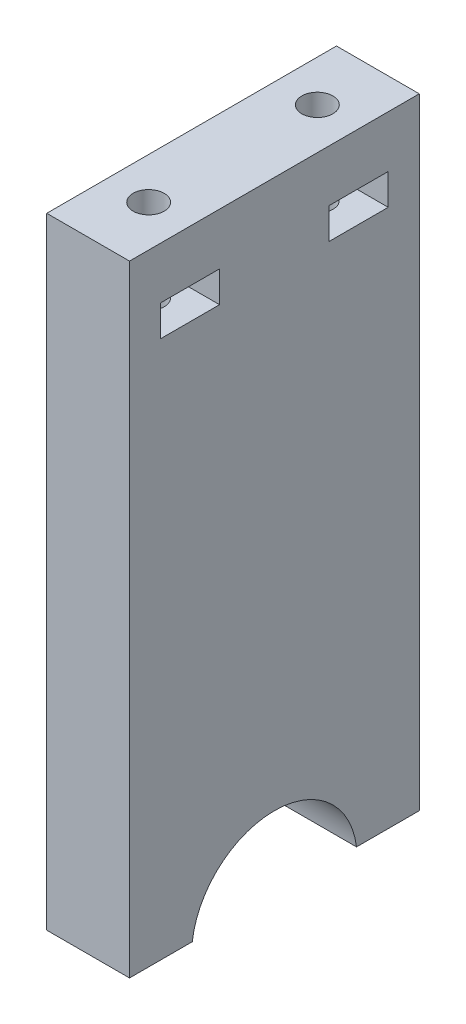
ISO-10303-21;
HEADER;
FILE_DESCRIPTION(('STEP AP214'),'2;1');
FILE_NAME('part.step','',(''),(''),'','','');
FILE_SCHEMA(('AUTOMOTIVE_DESIGN { 1 0 10303 214 1 1 1 1 }'));
ENDSEC;
DATA;
#1=APPLICATION_CONTEXT('core data for automotive mechanical design processes');
#2=APPLICATION_PROTOCOL_DEFINITION('international standard','automotive_design',2000,#1);
#3=PRODUCT_CONTEXT('',#1,'mechanical');
#4=PRODUCT('Part','Part','',(#3));
#5=PRODUCT_RELATED_PRODUCT_CATEGORY('part','',(#4));
#6=PRODUCT_DEFINITION_FORMATION('','',#4);
#7=PRODUCT_DEFINITION_CONTEXT('part definition',#1,'design');
#8=PRODUCT_DEFINITION('design','',#6,#7);
#9=PRODUCT_DEFINITION_SHAPE('','',#8);
#10=(LENGTH_UNIT() NAMED_UNIT(*) SI_UNIT(.MILLI.,.METRE.));
#11=(NAMED_UNIT(*) PLANE_ANGLE_UNIT() SI_UNIT($,.RADIAN.));
#12=(NAMED_UNIT(*) SI_UNIT($,.STERADIAN.) SOLID_ANGLE_UNIT());
#13=UNCERTAINTY_MEASURE_WITH_UNIT(LENGTH_MEASURE(1.E-05),#10,'distance_accuracy_value','');
#14=(GEOMETRIC_REPRESENTATION_CONTEXT(3) GLOBAL_UNCERTAINTY_ASSIGNED_CONTEXT((#13)) GLOBAL_UNIT_ASSIGNED_CONTEXT((#10,
#11,#12)) REPRESENTATION_CONTEXT('',''));
#15=CARTESIAN_POINT('',(0.,0.,0.));
#16=DIRECTION('',(0.,0.,1.));
#17=DIRECTION('',(1.,0.,0.));
#18=AXIS2_PLACEMENT_3D('',#15,#16,#17);
#19=CARTESIAN_POINT('',(0.,0.,0.));
#20=DIRECTION('',(0.,1.,0.));
#21=DIRECTION('',(0.,0.,1.));
#22=AXIS2_PLACEMENT_3D('',#19,#20,#21);
#23=PLANE('',#22);
#24=CARTESIAN_POINT('',(5.99999999999999,0.,2.65044247787611));
#25=DIRECTION('',(0.,-1.,0.));
#26=DIRECTION('',(0.,0.,-1.));
#27=AXIS2_PLACEMENT_3D('',#24,#25,#26);
#28=CIRCLE('',#27,1.5);
#29=CARTESIAN_POINT('',(5.99999999999999,0.,1.15044247787611));
#30=VERTEX_POINT('',#29);
#31=EDGE_CURVE('E201',#30,#30,#28,.T.);
#32=ORIENTED_EDGE('',*,*,#31,.F.);
#33=EDGE_LOOP('',(#32));
#34=FACE_BOUND('',#33,.T.);
#35=DIRECTION('',(0.,0.,1.));
#36=VECTOR('',#35,1.);
#37=CARTESIAN_POINT('',(1.99999999999999,0.,-21.8495575221239));
#38=LINE('',#37,#36);
#39=CARTESIAN_POINT('',(1.99999999999999,0.,0.0876964110698811));
#40=VERTEX_POINT('',#39);
#41=CARTESIAN_POINT('',(1.99999999999999,0.,6.15044247787611));
#42=VERTEX_POINT('',#41);
#43=EDGE_CURVE('E227',#40,#42,#38,.T.);
#44=ORIENTED_EDGE('',*,*,#43,.F.);
#45=DIRECTION('',(1.,0.,0.));
#46=VECTOR('',#45,1.);
#47=CARTESIAN_POINT('',(1.99999999999999,0.,0.0876964110698811));
#48=LINE('',#47,#46);
#49=CARTESIAN_POINT('',(9.99999999999999,0.,0.0876964110698806));
#50=VERTEX_POINT('',#49);
#51=EDGE_CURVE('E223',#40,#50,#48,.T.);
#52=ORIENTED_EDGE('',*,*,#51,.T.);
#53=DIRECTION('',(0.,0.,-1.));
#54=VECTOR('',#53,1.);
#55=CARTESIAN_POINT('',(9.99999999999999,0.,-21.8495575221239));
#56=LINE('',#55,#54);
#57=CARTESIAN_POINT('',(9.99999999999999,0.,6.15044247787611));
#58=VERTEX_POINT('',#57);
#59=EDGE_CURVE('E247',#58,#50,#56,.T.);
#60=ORIENTED_EDGE('',*,*,#59,.F.);
#61=DIRECTION('',(1.,0.,0.));
#62=VECTOR('',#61,1.);
#63=CARTESIAN_POINT('',(1.99999999999999,0.,6.15044247787611));
#64=LINE('',#63,#62);
#65=EDGE_CURVE('E244',#42,#58,#64,.T.);
#66=ORIENTED_EDGE('',*,*,#65,.F.);
#67=EDGE_LOOP('',(#44,#52,#60,#66));
#68=FACE_BOUND('',#67,.T.);
#69=ADVANCED_FACE('F33',(#34,#68),#23,.F.);
#70=CARTESIAN_POINT('',(1.99999999999999,60.,-21.8495575221239));
#71=DIRECTION('',(1.,0.,0.));
#72=DIRECTION('',(0.,0.,-1.));
#73=AXIS2_PLACEMENT_3D('',#70,#71,#72);
#74=PLANE('',#73);
#75=DIRECTION('',(0.,0.,1.));
#76=VECTOR('',#75,1.);
#77=CARTESIAN_POINT('',(1.99999999999999,52.,-2.54955752212389));
#78=LINE('',#77,#76);
#79=CARTESIAN_POINT('',(1.99999999999999,52.,-2.54955752212389));
#80=VERTEX_POINT('',#79);
#81=CARTESIAN_POINT('',(1.99999999999999,52.,3.15044247787611));
#82=VERTEX_POINT('',#81);
#83=EDGE_CURVE('E166',#80,#82,#78,.T.);
#84=ORIENTED_EDGE('',*,*,#83,.F.);
#85=DIRECTION('',(0.,-1.,0.));
#86=VECTOR('',#85,1.);
#87=CARTESIAN_POINT('',(1.99999999999999,52.,-2.54955752212389));
#88=LINE('',#87,#86);
#89=CARTESIAN_POINT('',(1.99999999999999,55.,-2.54955752212389));
#90=VERTEX_POINT('',#89);
#91=EDGE_CURVE('E50',#90,#80,#88,.T.);
#92=ORIENTED_EDGE('',*,*,#91,.F.);
#93=DIRECTION('',(0.,0.,-1.));
#94=VECTOR('',#93,1.);
#95=CARTESIAN_POINT('',(1.99999999999999,55.,-2.54955752212389));
#96=LINE('',#95,#94);
#97=CARTESIAN_POINT('',(1.99999999999999,55.,3.15044247787611));
#98=VERTEX_POINT('',#97);
#99=EDGE_CURVE('E154',#98,#90,#96,.T.);
#100=ORIENTED_EDGE('',*,*,#99,.F.);
#101=DIRECTION('',(0.,1.,0.));
#102=VECTOR('',#101,1.);
#103=CARTESIAN_POINT('',(1.99999999999999,52.,3.15044247787611));
#104=LINE('',#103,#102);
#105=EDGE_CURVE('E157',#82,#98,#104,.T.);
#106=ORIENTED_EDGE('',*,*,#105,.F.);
#107=EDGE_LOOP('',(#84,#92,#100,#106));
#108=FACE_BOUND('',#107,.T.);
#109=DIRECTION('',(0.,0.,1.));
#110=VECTOR('',#109,1.);
#111=CARTESIAN_POINT('',(1.99999999999999,52.,-18.8495575221239));
#112=LINE('',#111,#110);
#113=CARTESIAN_POINT('',(1.99999999999999,52.,-18.8495575221239));
#114=VERTEX_POINT('',#113);
#115=CARTESIAN_POINT('',(1.99999999999999,52.,-13.1495575221239));
#116=VERTEX_POINT('',#115);
#117=EDGE_CURVE('E191',#114,#116,#112,.T.);
#118=ORIENTED_EDGE('',*,*,#117,.F.);
#119=DIRECTION('',(0.,-1.,0.));
#120=VECTOR('',#119,1.);
#121=CARTESIAN_POINT('',(1.99999999999999,52.,-18.8495575221239));
#122=LINE('',#121,#120);
#123=CARTESIAN_POINT('',(1.99999999999999,55.,-18.8495575221239));
#124=VERTEX_POINT('',#123);
#125=EDGE_CURVE('E172',#124,#114,#122,.T.);
#126=ORIENTED_EDGE('',*,*,#125,.F.);
#127=DIRECTION('',(0.,0.,-1.));
#128=VECTOR('',#127,1.);
#129=CARTESIAN_POINT('',(1.99999999999999,55.,-18.8495575221239));
#130=LINE('',#129,#128);
#131=CARTESIAN_POINT('',(1.99999999999999,55.,-13.1495575221239));
#132=VERTEX_POINT('',#131);
#133=EDGE_CURVE('E180',#132,#124,#130,.T.);
#134=ORIENTED_EDGE('',*,*,#133,.F.);
#135=DIRECTION('',(0.,1.,0.));
#136=VECTOR('',#135,1.);
#137=CARTESIAN_POINT('',(1.99999999999999,52.,-13.1495575221239));
#138=LINE('',#137,#136);
#139=EDGE_CURVE('E194',#116,#132,#138,.T.);
#140=ORIENTED_EDGE('',*,*,#139,.F.);
#141=EDGE_LOOP('',(#118,#126,#134,#140));
#142=FACE_BOUND('',#141,.T.);
#143=CARTESIAN_POINT('',(1.99999999999999,0.,-21.8495575221239));
#144=VERTEX_POINT('',#143);
#145=CARTESIAN_POINT('',(1.99999999999999,0.,-15.7868114553177));
#146=VERTEX_POINT('',#145);
#147=EDGE_CURVE('E241',#144,#146,#38,.T.);
#148=ORIENTED_EDGE('',*,*,#147,.T.);
#149=CARTESIAN_POINT('',(1.99999999999999,-1.,-7.84955752212389));
#150=DIRECTION('',(1.,0.,0.));
#151=DIRECTION('',(0.,0.,-1.));
#152=AXIS2_PLACEMENT_3D('',#149,#150,#151);
#153=CIRCLE('',#152,8.);
#154=EDGE_CURVE('E220',#146,#40,#153,.T.);
#155=ORIENTED_EDGE('',*,*,#154,.T.);
#156=ORIENTED_EDGE('',*,*,#43,.T.);
#157=DIRECTION('',(0.,-1.,0.));
#158=VECTOR('',#157,1.);
#159=CARTESIAN_POINT('',(1.99999999999999,60.,6.15044247787611));
#160=LINE('',#159,#158);
#161=CARTESIAN_POINT('',(1.99999999999999,60.,6.15044247787611));
#162=VERTEX_POINT('',#161);
#163=EDGE_CURVE('E11',#162,#42,#160,.T.);
#164=ORIENTED_EDGE('',*,*,#163,.F.);
#165=DIRECTION('',(0.,0.,1.));
#166=VECTOR('',#165,1.);
#167=CARTESIAN_POINT('',(1.99999999999999,60.,-21.8495575221239));
#168=LINE('',#167,#166);
#169=CARTESIAN_POINT('',(1.99999999999999,60.,-21.8495575221239));
#170=VERTEX_POINT('',#169);
#171=EDGE_CURVE('E230',#170,#162,#168,.T.);
#172=ORIENTED_EDGE('',*,*,#171,.F.);
#173=DIRECTION('',(0.,-1.,0.));
#174=VECTOR('',#173,1.);
#175=CARTESIAN_POINT('',(1.99999999999999,60.,-21.8495575221239));
#176=LINE('',#175,#174);
#177=EDGE_CURVE('E240',#170,#144,#176,.T.);
#178=ORIENTED_EDGE('',*,*,#177,.T.);
#179=EDGE_LOOP('',(#148,#155,#156,#164,#172,#178));
#180=FACE_BOUND('',#179,.T.);
#181=ADVANCED_FACE('F35',(#108,#142,#180),#74,.F.);
#182=CARTESIAN_POINT('',(1.99999999999999,60.,6.15044247787611));
#183=DIRECTION('',(0.,0.,-1.));
#184=DIRECTION('',(-1.,0.,0.));
#185=AXIS2_PLACEMENT_3D('',#182,#183,#184);
#186=PLANE('',#185);
#187=ORIENTED_EDGE('',*,*,#65,.T.);
#188=DIRECTION('',(0.,-1.,0.));
#189=VECTOR('',#188,1.);
#190=CARTESIAN_POINT('',(9.99999999999999,60.,6.15044247787611));
#191=LINE('',#190,#189);
#192=CARTESIAN_POINT('',(9.99999999999999,60.,6.15044247787611));
#193=VERTEX_POINT('',#192);
#194=EDGE_CURVE('E42',#193,#58,#191,.T.);
#195=ORIENTED_EDGE('',*,*,#194,.F.);
#196=DIRECTION('',(1.,0.,0.));
#197=VECTOR('',#196,1.);
#198=CARTESIAN_POINT('',(1.99999999999999,60.,6.15044247787611));
#199=LINE('',#198,#197);
#200=EDGE_CURVE('E233',#162,#193,#199,.T.);
#201=ORIENTED_EDGE('',*,*,#200,.F.);
#202=ORIENTED_EDGE('',*,*,#163,.T.);
#203=EDGE_LOOP('',(#187,#195,#201,#202));
#204=FACE_BOUND('',#203,.T.);
#205=ADVANCED_FACE('F305',(#204),#186,.F.);
#206=CARTESIAN_POINT('',(9.99999999999999,60.,-21.8495575221239));
#207=DIRECTION('',(-1.,0.,0.));
#208=DIRECTION('',(0.,0.,1.));
#209=AXIS2_PLACEMENT_3D('',#206,#207,#208);
#210=PLANE('',#209);
#211=DIRECTION('',(0.,0.,-1.));
#212=VECTOR('',#211,1.);
#213=CARTESIAN_POINT('',(10.,55.,-2.5495575221239));
#214=LINE('',#213,#212);
#215=CARTESIAN_POINT('',(10.,55.,3.1504424778761));
#216=VERTEX_POINT('',#215);
#217=CARTESIAN_POINT('',(10.,55.,-2.5495575221239));
#218=VERTEX_POINT('',#217);
#219=EDGE_CURVE('E144',#216,#218,#214,.T.);
#220=ORIENTED_EDGE('',*,*,#219,.T.);
#221=DIRECTION('',(0.,-1.,0.));
#222=VECTOR('',#221,1.);
#223=CARTESIAN_POINT('',(10.,52.,-2.5495575221239));
#224=LINE('',#223,#222);
#225=CARTESIAN_POINT('',(10.,52.,-2.5495575221239));
#226=VERTEX_POINT('',#225);
#227=EDGE_CURVE('E138',#218,#226,#224,.T.);
#228=ORIENTED_EDGE('',*,*,#227,.T.);
#229=DIRECTION('',(0.,0.,1.));
#230=VECTOR('',#229,1.);
#231=CARTESIAN_POINT('',(10.,52.,-2.5495575221239));
#232=LINE('',#231,#230);
#233=CARTESIAN_POINT('',(9.99999999999999,52.,3.15044247787611));
#234=VERTEX_POINT('',#233);
#235=EDGE_CURVE('E147',#226,#234,#232,.T.);
#236=ORIENTED_EDGE('',*,*,#235,.T.);
#237=DIRECTION('',(0.,1.,0.));
#238=VECTOR('',#237,1.);
#239=CARTESIAN_POINT('',(10.,52.,3.1504424778761));
#240=LINE('',#239,#238);
#241=EDGE_CURVE('E58',#234,#216,#240,.T.);
#242=ORIENTED_EDGE('',*,*,#241,.T.);
#243=EDGE_LOOP('',(#220,#228,#236,#242));
#244=FACE_BOUND('',#243,.T.);
#245=DIRECTION('',(0.,0.,-1.));
#246=VECTOR('',#245,1.);
#247=CARTESIAN_POINT('',(9.99999999999999,55.,-18.8495575221239));
#248=LINE('',#247,#246);
#249=CARTESIAN_POINT('',(9.99999999999999,55.,-13.1495575221239));
#250=VERTEX_POINT('',#249);
#251=CARTESIAN_POINT('',(9.99999999999999,55.,-18.8495575221239));
#252=VERTEX_POINT('',#251);
#253=EDGE_CURVE('E186',#250,#252,#248,.T.);
#254=ORIENTED_EDGE('',*,*,#253,.T.);
#255=DIRECTION('',(0.,-1.,0.));
#256=VECTOR('',#255,1.);
#257=CARTESIAN_POINT('',(9.99999999999999,52.,-18.8495575221239));
#258=LINE('',#257,#256);
#259=CARTESIAN_POINT('',(9.99999999999999,52.,-18.8495575221239));
#260=VERTEX_POINT('',#259);
#261=EDGE_CURVE('E176',#252,#260,#258,.T.);
#262=ORIENTED_EDGE('',*,*,#261,.T.);
#263=DIRECTION('',(0.,0.,1.));
#264=VECTOR('',#263,1.);
#265=CARTESIAN_POINT('',(9.99999999999999,52.,-18.8495575221239));
#266=LINE('',#265,#264);
#267=CARTESIAN_POINT('',(9.99999999999999,52.,-13.1495575221239));
#268=VERTEX_POINT('',#267);
#269=EDGE_CURVE('E179',#260,#268,#266,.T.);
#270=ORIENTED_EDGE('',*,*,#269,.T.);
#271=DIRECTION('',(0.,1.,0.));
#272=VECTOR('',#271,1.);
#273=CARTESIAN_POINT('',(9.99999999999999,52.,-13.1495575221239));
#274=LINE('',#273,#272);
#275=EDGE_CURVE('E183',#268,#250,#274,.T.);
#276=ORIENTED_EDGE('',*,*,#275,.T.);
#277=EDGE_LOOP('',(#254,#262,#270,#276));
#278=FACE_BOUND('',#277,.T.);
#279=ORIENTED_EDGE('',*,*,#59,.T.);
#280=CARTESIAN_POINT('',(9.99999999999999,-1.,-7.84955752212389));
#281=DIRECTION('',(1.,0.,0.));
#282=DIRECTION('',(0.,0.,-1.));
#283=AXIS2_PLACEMENT_3D('',#280,#281,#282);
#284=CIRCLE('',#283,8.);
#285=CARTESIAN_POINT('',(9.99999999999999,0.,-15.7868114553177));
#286=VERTEX_POINT('',#285);
#287=EDGE_CURVE('E217',#286,#50,#284,.T.);
#288=ORIENTED_EDGE('',*,*,#287,.F.);
#289=CARTESIAN_POINT('',(9.99999999999999,0.,-21.8495575221239));
#290=VERTEX_POINT('',#289);
#291=EDGE_CURVE('E246',#286,#290,#56,.T.);
#292=ORIENTED_EDGE('',*,*,#291,.T.);
#293=DIRECTION('',(0.,-1.,0.));
#294=VECTOR('',#293,1.);
#295=CARTESIAN_POINT('',(9.99999999999999,60.,-21.8495575221239));
#296=LINE('',#295,#294);
#297=CARTESIAN_POINT('',(9.99999999999999,60.,-21.8495575221239));
#298=VERTEX_POINT('',#297);
#299=EDGE_CURVE('E253',#298,#290,#296,.T.);
#300=ORIENTED_EDGE('',*,*,#299,.F.);
#301=DIRECTION('',(0.,0.,-1.));
#302=VECTOR('',#301,1.);
#303=CARTESIAN_POINT('',(9.99999999999999,60.,-21.8495575221239));
#304=LINE('',#303,#302);
#305=EDGE_CURVE('E236',#193,#298,#304,.T.);
#306=ORIENTED_EDGE('',*,*,#305,.F.);
#307=ORIENTED_EDGE('',*,*,#194,.T.);
#308=EDGE_LOOP('',(#279,#288,#292,#300,#306,#307));
#309=FACE_BOUND('',#308,.T.);
#310=ADVANCED_FACE('F151',(#244,#278,#309),#210,.F.);
#311=CARTESIAN_POINT('',(1.99999999999999,60.,-21.8495575221239));
#312=DIRECTION('',(0.,0.,1.));
#313=DIRECTION('',(1.,0.,0.));
#314=AXIS2_PLACEMENT_3D('',#311,#312,#313);
#315=PLANE('',#314);
#316=DIRECTION('',(-1.,0.,0.));
#317=VECTOR('',#316,1.);
#318=CARTESIAN_POINT('',(1.99999999999999,0.,-21.8495575221239));
#319=LINE('',#318,#317);
#320=EDGE_CURVE('E234',#290,#144,#319,.T.);
#321=ORIENTED_EDGE('',*,*,#320,.T.);
#322=ORIENTED_EDGE('',*,*,#177,.F.);
#323=DIRECTION('',(-1.,0.,0.));
#324=VECTOR('',#323,1.);
#325=CARTESIAN_POINT('',(1.99999999999999,60.,-21.8495575221239));
#326=LINE('',#325,#324);
#327=EDGE_CURVE('E238',#298,#170,#326,.T.);
#328=ORIENTED_EDGE('',*,*,#327,.F.);
#329=ORIENTED_EDGE('',*,*,#299,.T.);
#330=EDGE_LOOP('',(#321,#322,#328,#329));
#331=FACE_BOUND('',#330,.T.);
#332=ADVANCED_FACE('F322',(#331),#315,.F.);
#333=CARTESIAN_POINT('',(0.,60.,0.));
#334=DIRECTION('',(0.,1.,0.));
#335=DIRECTION('',(0.,0.,1.));
#336=AXIS2_PLACEMENT_3D('',#333,#334,#335);
#337=PLANE('',#336);
#338=CARTESIAN_POINT('',(5.99999999999999,60.,0.300442477876107));
#339=DIRECTION('',(0.,1.,0.));
#340=DIRECTION('',(0.,0.,1.));
#341=AXIS2_PLACEMENT_3D('',#338,#339,#340);
#342=CIRCLE('',#341,1.5);
#343=CARTESIAN_POINT('',(5.99999999999999,60.,1.80044247787611));
#344=VERTEX_POINT('',#343);
#345=EDGE_CURVE('E273',#344,#344,#342,.T.);
#346=ORIENTED_EDGE('',*,*,#345,.F.);
#347=EDGE_LOOP('',(#346));
#348=FACE_BOUND('',#347,.T.);
#349=CARTESIAN_POINT('',(5.99999999999999,60.,-15.9995575221239));
#350=DIRECTION('',(0.,1.,0.));
#351=DIRECTION('',(0.,0.,1.));
#352=AXIS2_PLACEMENT_3D('',#349,#350,#351);
#353=CIRCLE('',#352,1.5);
#354=CARTESIAN_POINT('',(5.99999999999999,60.,-14.4995575221239));
#355=VERTEX_POINT('',#354);
#356=EDGE_CURVE('E264',#355,#355,#353,.T.);
#357=ORIENTED_EDGE('',*,*,#356,.F.);
#358=EDGE_LOOP('',(#357));
#359=FACE_BOUND('',#358,.T.);
#360=ORIENTED_EDGE('',*,*,#171,.T.);
#361=ORIENTED_EDGE('',*,*,#200,.T.);
#362=ORIENTED_EDGE('',*,*,#305,.T.);
#363=ORIENTED_EDGE('',*,*,#327,.T.);
#364=EDGE_LOOP('',(#360,#361,#362,#363));
#365=FACE_BOUND('',#364,.T.);
#366=ADVANCED_FACE('F313',(#348,#359,#365),#337,.T.);
#367=CARTESIAN_POINT('',(5.99999999999999,0.,-18.3495575221239));
#368=DIRECTION('',(0.,-1.,0.));
#369=DIRECTION('',(0.,0.,-1.));
#370=AXIS2_PLACEMENT_3D('',#367,#368,#369);
#371=CIRCLE('',#370,1.5);
#372=CARTESIAN_POINT('',(5.99999999999999,0.,-19.8495575221239));
#373=VERTEX_POINT('',#372);
#374=EDGE_CURVE('E211',#373,#373,#371,.T.);
#375=ORIENTED_EDGE('',*,*,#374,.F.);
#376=EDGE_LOOP('',(#375));
#377=FACE_BOUND('',#376,.T.);
#378=ORIENTED_EDGE('',*,*,#291,.F.);
#379=DIRECTION('',(1.,0.,0.));
#380=VECTOR('',#379,1.);
#381=CARTESIAN_POINT('',(1.99999999999999,0.,-15.7868114553177));
#382=LINE('',#381,#380);
#383=EDGE_CURVE('E225',#146,#286,#382,.T.);
#384=ORIENTED_EDGE('',*,*,#383,.F.);
#385=ORIENTED_EDGE('',*,*,#147,.F.);
#386=ORIENTED_EDGE('',*,*,#320,.F.);
#387=EDGE_LOOP('',(#378,#384,#385,#386));
#388=FACE_BOUND('',#387,.T.);
#389=ADVANCED_FACE('F301',(#377,#388),#23,.F.);
#390=CARTESIAN_POINT('',(1.99999999999999,-1.,-7.84955752212389));
#391=DIRECTION('',(1.,0.,0.));
#392=DIRECTION('',(0.,0.,-1.));
#393=AXIS2_PLACEMENT_3D('',#390,#391,#392);
#394=CYLINDRICAL_SURFACE('',#393,8.);
#395=ORIENTED_EDGE('',*,*,#287,.T.);
#396=ORIENTED_EDGE('',*,*,#51,.F.);
#397=ORIENTED_EDGE('',*,*,#154,.F.);
#398=ORIENTED_EDGE('',*,*,#383,.T.);
#399=EDGE_LOOP('',(#395,#396,#397,#398));
#400=FACE_BOUND('',#399,.T.);
#401=ADVANCED_FACE('F312',(#400),#394,.F.);
#402=CARTESIAN_POINT('',(5.99999999999999,25.,-18.3495575221239));
#403=DIRECTION('',(0.,-1.,0.));
#404=DIRECTION('',(0.,0.,-1.));
#405=AXIS2_PLACEMENT_3D('',#402,#403,#404);
#406=CYLINDRICAL_SURFACE('',#405,1.5);
#407=CARTESIAN_POINT('',(5.99999999999999,25.,-18.3495575221239));
#408=DIRECTION('',(0.,-1.,0.));
#409=DIRECTION('',(0.,0.,-1.));
#410=AXIS2_PLACEMENT_3D('',#407,#408,#409);
#411=CIRCLE('',#410,1.5);
#412=CARTESIAN_POINT('',(5.99999999999999,25.,-19.8495575221239));
#413=VERTEX_POINT('',#412);
#414=EDGE_CURVE('E214',#413,#413,#411,.T.);
#415=ORIENTED_EDGE('',*,*,#414,.F.);
#416=EDGE_LOOP('',(#415));
#417=FACE_BOUND('',#416,.T.);
#418=ORIENTED_EDGE('',*,*,#374,.T.);
#419=EDGE_LOOP('',(#418));
#420=FACE_BOUND('',#419,.T.);
#421=ADVANCED_FACE('F319',(#417,#420),#406,.F.);
#422=CARTESIAN_POINT('',(5.99999999999999,25.,-18.3495575221239));
#423=DIRECTION('',(0.,-1.,0.));
#424=DIRECTION('',(0.,0.,-1.));
#425=AXIS2_PLACEMENT_3D('',#422,#423,#424);
#426=PLANE('',#425);
#427=ORIENTED_EDGE('',*,*,#414,.T.);
#428=EDGE_LOOP('',(#427));
#429=FACE_BOUND('',#428,.T.);
#430=ADVANCED_FACE('F474',(#429),#426,.T.);
#431=CARTESIAN_POINT('',(5.99999999999999,25.,2.65044247787611));
#432=DIRECTION('',(0.,-1.,0.));
#433=DIRECTION('',(0.,0.,-1.));
#434=AXIS2_PLACEMENT_3D('',#431,#432,#433);
#435=CYLINDRICAL_SURFACE('',#434,1.5);
#436=CARTESIAN_POINT('',(5.99999999999999,25.,2.65044247787611));
#437=DIRECTION('',(0.,-1.,0.));
#438=DIRECTION('',(0.,0.,-1.));
#439=AXIS2_PLACEMENT_3D('',#436,#437,#438);
#440=CIRCLE('',#439,1.5);
#441=CARTESIAN_POINT('',(5.99999999999999,25.,1.15044247787611));
#442=VERTEX_POINT('',#441);
#443=EDGE_CURVE('E208',#442,#442,#440,.T.);
#444=ORIENTED_EDGE('',*,*,#443,.F.);
#445=EDGE_LOOP('',(#444));
#446=FACE_BOUND('',#445,.T.);
#447=ORIENTED_EDGE('',*,*,#31,.T.);
#448=EDGE_LOOP('',(#447));
#449=FACE_BOUND('',#448,.T.);
#450=ADVANCED_FACE('F470',(#446,#449),#435,.F.);
#451=CARTESIAN_POINT('',(5.99999999999999,25.,2.65044247787611));
#452=DIRECTION('',(0.,-1.,0.));
#453=DIRECTION('',(0.,0.,-1.));
#454=AXIS2_PLACEMENT_3D('',#451,#452,#453);
#455=PLANE('',#454);
#456=ORIENTED_EDGE('',*,*,#443,.T.);
#457=EDGE_LOOP('',(#456));
#458=FACE_BOUND('',#457,.T.);
#459=ADVANCED_FACE('F466',(#458),#455,.T.);
#460=CARTESIAN_POINT('',(9.99999999999999,52.,-18.8495575221239));
#461=DIRECTION('',(0.,0.,-1.));
#462=DIRECTION('',(-1.,0.,0.));
#463=AXIS2_PLACEMENT_3D('',#460,#461,#462);
#464=PLANE('',#463);
#465=ORIENTED_EDGE('',*,*,#125,.T.);
#466=DIRECTION('',(-1.,0.,0.));
#467=VECTOR('',#466,1.);
#468=CARTESIAN_POINT('',(9.99999999999999,52.,-18.8495575221239));
#469=LINE('',#468,#467);
#470=EDGE_CURVE('E189',#260,#114,#469,.T.);
#471=ORIENTED_EDGE('',*,*,#470,.F.);
#472=ORIENTED_EDGE('',*,*,#261,.F.);
#473=DIRECTION('',(-1.,0.,0.));
#474=VECTOR('',#473,1.);
#475=CARTESIAN_POINT('',(9.99999999999999,55.,-18.8495575221239));
#476=LINE('',#475,#474);
#477=EDGE_CURVE('E199',#252,#124,#476,.T.);
#478=ORIENTED_EDGE('',*,*,#477,.T.);
#479=EDGE_LOOP('',(#465,#471,#472,#478));
#480=FACE_BOUND('',#479,.T.);
#481=ADVANCED_FACE('F379',(#480),#464,.F.);
#482=CARTESIAN_POINT('',(9.99999999999999,55.,-18.8495575221239));
#483=DIRECTION('',(0.,1.,0.));
#484=DIRECTION('',(0.,0.,1.));
#485=AXIS2_PLACEMENT_3D('',#482,#483,#484);
#486=PLANE('',#485);
#487=CARTESIAN_POINT('',(5.99999999999999,55.,-15.9995575221239));
#488=DIRECTION('',(0.,1.,0.));
#489=DIRECTION('',(0.,0.,1.));
#490=AXIS2_PLACEMENT_3D('',#487,#488,#489);
#491=CIRCLE('',#490,1.5);
#492=CARTESIAN_POINT('',(5.99999999999999,55.,-14.4995575221239));
#493=VERTEX_POINT('',#492);
#494=EDGE_CURVE('E160',#493,#493,#491,.T.);
#495=ORIENTED_EDGE('',*,*,#494,.T.);
#496=EDGE_LOOP('',(#495));
#497=FACE_BOUND('',#496,.T.);
#498=ORIENTED_EDGE('',*,*,#133,.T.);
#499=ORIENTED_EDGE('',*,*,#477,.F.);
#500=ORIENTED_EDGE('',*,*,#253,.F.);
#501=DIRECTION('',(-1.,0.,0.));
#502=VECTOR('',#501,1.);
#503=CARTESIAN_POINT('',(9.99999999999999,55.,-13.1495575221239));
#504=LINE('',#503,#502);
#505=EDGE_CURVE('E202',#250,#132,#504,.T.);
#506=ORIENTED_EDGE('',*,*,#505,.T.);
#507=EDGE_LOOP('',(#498,#499,#500,#506));
#508=FACE_BOUND('',#507,.T.);
#509=ADVANCED_FACE('F373',(#497,#508),#486,.F.);
#510=CARTESIAN_POINT('',(9.99999999999999,52.,-13.1495575221239));
#511=DIRECTION('',(0.,0.,1.));
#512=DIRECTION('',(1.,0.,0.));
#513=AXIS2_PLACEMENT_3D('',#510,#511,#512);
#514=PLANE('',#513);
#515=ORIENTED_EDGE('',*,*,#139,.T.);
#516=ORIENTED_EDGE('',*,*,#505,.F.);
#517=ORIENTED_EDGE('',*,*,#275,.F.);
#518=DIRECTION('',(-1.,0.,0.));
#519=VECTOR('',#518,1.);
#520=CARTESIAN_POINT('',(9.99999999999999,52.,-13.1495575221239));
#521=LINE('',#520,#519);
#522=EDGE_CURVE('E204',#268,#116,#521,.T.);
#523=ORIENTED_EDGE('',*,*,#522,.T.);
#524=EDGE_LOOP('',(#515,#516,#517,#523));
#525=FACE_BOUND('',#524,.T.);
#526=ADVANCED_FACE('F378',(#525),#514,.F.);
#527=CARTESIAN_POINT('',(9.99999999999999,52.,-18.8495575221239));
#528=DIRECTION('',(0.,-1.,0.));
#529=DIRECTION('',(0.,0.,-1.));
#530=AXIS2_PLACEMENT_3D('',#527,#528,#529);
#531=PLANE('',#530);
#532=CARTESIAN_POINT('',(5.99999999999999,52.,-15.9995575221239));
#533=DIRECTION('',(0.,-1.,0.));
#534=DIRECTION('',(0.,0.,-1.));
#535=AXIS2_PLACEMENT_3D('',#532,#533,#534);
#536=CIRCLE('',#535,1.5);
#537=CARTESIAN_POINT('',(5.99999999999999,52.,-17.4995575221239));
#538=VERTEX_POINT('',#537);
#539=EDGE_CURVE('E257',#538,#538,#536,.T.);
#540=ORIENTED_EDGE('',*,*,#539,.T.);
#541=EDGE_LOOP('',(#540));
#542=FACE_BOUND('',#541,.T.);
#543=ORIENTED_EDGE('',*,*,#117,.T.);
#544=ORIENTED_EDGE('',*,*,#522,.F.);
#545=ORIENTED_EDGE('',*,*,#269,.F.);
#546=ORIENTED_EDGE('',*,*,#470,.T.);
#547=EDGE_LOOP('',(#543,#544,#545,#546));
#548=FACE_BOUND('',#547,.T.);
#549=ADVANCED_FACE('F389',(#542,#548),#531,.F.);
#550=CARTESIAN_POINT('',(10.,52.,-2.5495575221239));
#551=DIRECTION('',(0.,0.,-1.));
#552=DIRECTION('',(-1.,0.,0.));
#553=AXIS2_PLACEMENT_3D('',#550,#551,#552);
#554=PLANE('',#553);
#555=ORIENTED_EDGE('',*,*,#91,.T.);
#556=DIRECTION('',(-1.,0.,0.));
#557=VECTOR('',#556,1.);
#558=CARTESIAN_POINT('',(10.,52.,-2.5495575221239));
#559=LINE('',#558,#557);
#560=EDGE_CURVE('E134',#226,#80,#559,.T.);
#561=ORIENTED_EDGE('',*,*,#560,.F.);
#562=ORIENTED_EDGE('',*,*,#227,.F.);
#563=DIRECTION('',(-1.,0.,0.));
#564=VECTOR('',#563,1.);
#565=CARTESIAN_POINT('',(10.,55.,-2.5495575221239));
#566=LINE('',#565,#564);
#567=EDGE_CURVE('E170',#218,#90,#566,.T.);
#568=ORIENTED_EDGE('',*,*,#567,.T.);
#569=EDGE_LOOP('',(#555,#561,#562,#568));
#570=FACE_BOUND('',#569,.T.);
#571=ADVANCED_FACE('F136',(#570),#554,.F.);
#572=CARTESIAN_POINT('',(10.,55.,-2.5495575221239));
#573=DIRECTION('',(0.,1.,0.));
#574=DIRECTION('',(0.,0.,1.));
#575=AXIS2_PLACEMENT_3D('',#572,#573,#574);
#576=PLANE('',#575);
#577=CARTESIAN_POINT('',(5.99999999999999,55.,0.300442477876107));
#578=DIRECTION('',(0.,1.,0.));
#579=DIRECTION('',(0.,0.,1.));
#580=AXIS2_PLACEMENT_3D('',#577,#578,#579);
#581=CIRCLE('',#580,1.5);
#582=CARTESIAN_POINT('',(5.99999999999999,55.,1.80044247787611));
#583=VERTEX_POINT('',#582);
#584=EDGE_CURVE('E269',#583,#583,#581,.T.);
#585=ORIENTED_EDGE('',*,*,#584,.T.);
#586=EDGE_LOOP('',(#585));
#587=FACE_BOUND('',#586,.T.);
#588=ORIENTED_EDGE('',*,*,#99,.T.);
#589=ORIENTED_EDGE('',*,*,#567,.F.);
#590=ORIENTED_EDGE('',*,*,#219,.F.);
#591=DIRECTION('',(-1.,0.,0.));
#592=VECTOR('',#591,1.);
#593=CARTESIAN_POINT('',(10.,55.,3.1504424778761));
#594=LINE('',#593,#592);
#595=EDGE_CURVE('E173',#216,#98,#594,.T.);
#596=ORIENTED_EDGE('',*,*,#595,.T.);
#597=EDGE_LOOP('',(#588,#589,#590,#596));
#598=FACE_BOUND('',#597,.T.);
#599=ADVANCED_FACE('F400',(#587,#598),#576,.F.);
#600=CARTESIAN_POINT('',(10.,52.,3.1504424778761));
#601=DIRECTION('',(0.,0.,1.));
#602=DIRECTION('',(1.,0.,0.));
#603=AXIS2_PLACEMENT_3D('',#600,#601,#602);
#604=PLANE('',#603);
#605=ORIENTED_EDGE('',*,*,#105,.T.);
#606=ORIENTED_EDGE('',*,*,#595,.F.);
#607=ORIENTED_EDGE('',*,*,#241,.F.);
#608=DIRECTION('',(-1.,0.,0.));
#609=VECTOR('',#608,1.);
#610=CARTESIAN_POINT('',(10.,52.,3.1504424778761));
#611=LINE('',#610,#609);
#612=EDGE_CURVE('E143',#234,#82,#611,.T.);
#613=ORIENTED_EDGE('',*,*,#612,.T.);
#614=EDGE_LOOP('',(#605,#606,#607,#613));
#615=FACE_BOUND('',#614,.T.);
#616=ADVANCED_FACE('F368',(#615),#604,.F.);
#617=CARTESIAN_POINT('',(10.,52.,-2.5495575221239));
#618=DIRECTION('',(0.,-1.,0.));
#619=DIRECTION('',(0.,0.,-1.));
#620=AXIS2_PLACEMENT_3D('',#617,#618,#619);
#621=PLANE('',#620);
#622=CARTESIAN_POINT('',(5.99999999999999,52.,0.300442477876107));
#623=DIRECTION('',(0.,-1.,0.));
#624=DIRECTION('',(0.,0.,-1.));
#625=AXIS2_PLACEMENT_3D('',#622,#623,#624);
#626=CIRCLE('',#625,1.5);
#627=CARTESIAN_POINT('',(5.99999999999999,52.,-1.19955752212389));
#628=VERTEX_POINT('',#627);
#629=EDGE_CURVE('E37',#628,#628,#626,.T.);
#630=ORIENTED_EDGE('',*,*,#629,.T.);
#631=EDGE_LOOP('',(#630));
#632=FACE_BOUND('',#631,.T.);
#633=ORIENTED_EDGE('',*,*,#83,.T.);
#634=ORIENTED_EDGE('',*,*,#612,.F.);
#635=ORIENTED_EDGE('',*,*,#235,.F.);
#636=ORIENTED_EDGE('',*,*,#560,.T.);
#637=EDGE_LOOP('',(#633,#634,#635,#636));
#638=FACE_BOUND('',#637,.T.);
#639=ADVANCED_FACE('F148',(#632,#638),#621,.F.);
#640=CARTESIAN_POINT('',(5.99999999999999,35.,-15.9995575221239));
#641=DIRECTION('',(0.,1.,0.));
#642=DIRECTION('',(0.,0.,1.));
#643=AXIS2_PLACEMENT_3D('',#640,#641,#642);
#644=PLANE('',#643);
#645=CARTESIAN_POINT('',(5.99999999999999,35.,-15.9995575221239));
#646=DIRECTION('',(0.,1.,0.));
#647=DIRECTION('',(0.,0.,1.));
#648=AXIS2_PLACEMENT_3D('',#645,#646,#647);
#649=CIRCLE('',#648,1.5);
#650=CARTESIAN_POINT('',(5.99999999999999,35.,-14.4995575221239));
#651=VERTEX_POINT('',#650);
#652=EDGE_CURVE('E259',#651,#651,#649,.T.);
#653=ORIENTED_EDGE('',*,*,#652,.T.);
#654=EDGE_LOOP('',(#653));
#655=FACE_BOUND('',#654,.T.);
#656=ADVANCED_FACE('F414',(#655),#644,.T.);
#657=CARTESIAN_POINT('',(5.99999999999999,35.,-15.9995575221239));
#658=DIRECTION('',(0.,1.,0.));
#659=DIRECTION('',(0.,0.,1.));
#660=AXIS2_PLACEMENT_3D('',#657,#658,#659);
#661=CYLINDRICAL_SURFACE('',#660,1.5);
#662=ORIENTED_EDGE('',*,*,#652,.F.);
#663=EDGE_LOOP('',(#662));
#664=FACE_BOUND('',#663,.T.);
#665=ORIENTED_EDGE('',*,*,#539,.F.);
#666=EDGE_LOOP('',(#665));
#667=FACE_BOUND('',#666,.T.);
#668=ADVANCED_FACE('F423',(#664,#667),#661,.F.);
#669=ORIENTED_EDGE('',*,*,#356,.T.);
#670=EDGE_LOOP('',(#669));
#671=FACE_BOUND('',#670,.T.);
#672=ORIENTED_EDGE('',*,*,#494,.F.);
#673=EDGE_LOOP('',(#672));
#674=FACE_BOUND('',#673,.T.);
#675=ADVANCED_FACE('F295',(#671,#674),#661,.F.);
#676=CARTESIAN_POINT('',(5.99999999999999,35.,0.300442477876107));
#677=DIRECTION('',(0.,1.,0.));
#678=DIRECTION('',(0.,0.,1.));
#679=AXIS2_PLACEMENT_3D('',#676,#677,#678);
#680=PLANE('',#679);
#681=CARTESIAN_POINT('',(5.99999999999999,35.,0.300442477876107));
#682=DIRECTION('',(0.,1.,0.));
#683=DIRECTION('',(0.,0.,1.));
#684=AXIS2_PLACEMENT_3D('',#681,#682,#683);
#685=CIRCLE('',#684,1.5);
#686=CARTESIAN_POINT('',(5.99999999999999,35.,1.80044247787611));
#687=VERTEX_POINT('',#686);
#688=EDGE_CURVE('E276',#687,#687,#685,.T.);
#689=ORIENTED_EDGE('',*,*,#688,.T.);
#690=EDGE_LOOP('',(#689));
#691=FACE_BOUND('',#690,.T.);
#692=ADVANCED_FACE('F287',(#691),#680,.T.);
#693=CARTESIAN_POINT('',(5.99999999999999,35.,0.300442477876107));
#694=DIRECTION('',(0.,1.,0.));
#695=DIRECTION('',(0.,0.,1.));
#696=AXIS2_PLACEMENT_3D('',#693,#694,#695);
#697=CYLINDRICAL_SURFACE('',#696,1.5);
#698=ORIENTED_EDGE('',*,*,#688,.F.);
#699=EDGE_LOOP('',(#698));
#700=FACE_BOUND('',#699,.T.);
#701=ORIENTED_EDGE('',*,*,#629,.F.);
#702=EDGE_LOOP('',(#701));
#703=FACE_BOUND('',#702,.T.);
#704=ADVANCED_FACE('F284',(#700,#703),#697,.F.);
#705=ORIENTED_EDGE('',*,*,#345,.T.);
#706=EDGE_LOOP('',(#705));
#707=FACE_BOUND('',#706,.T.);
#708=ORIENTED_EDGE('',*,*,#584,.F.);
#709=EDGE_LOOP('',(#708));
#710=FACE_BOUND('',#709,.T.);
#711=ADVANCED_FACE('F286',(#707,#710),#697,.F.);
#712=CLOSED_SHELL('',(#69,#181,#205,#310,#332,#366,#389,#401,#421,#430,#450,#459,#481,#509,#526,
#549,#571,#599,#616,#639,#656,#668,#675,#692,#704,#711));
#713=MANIFOLD_SOLID_BREP('B2',#712);
#714=ADVANCED_BREP_SHAPE_REPRESENTATION('',(#18,#713),#14);
#715=SHAPE_DEFINITION_REPRESENTATION(#9,#714);
ENDSEC;
END-ISO-10303-21;
